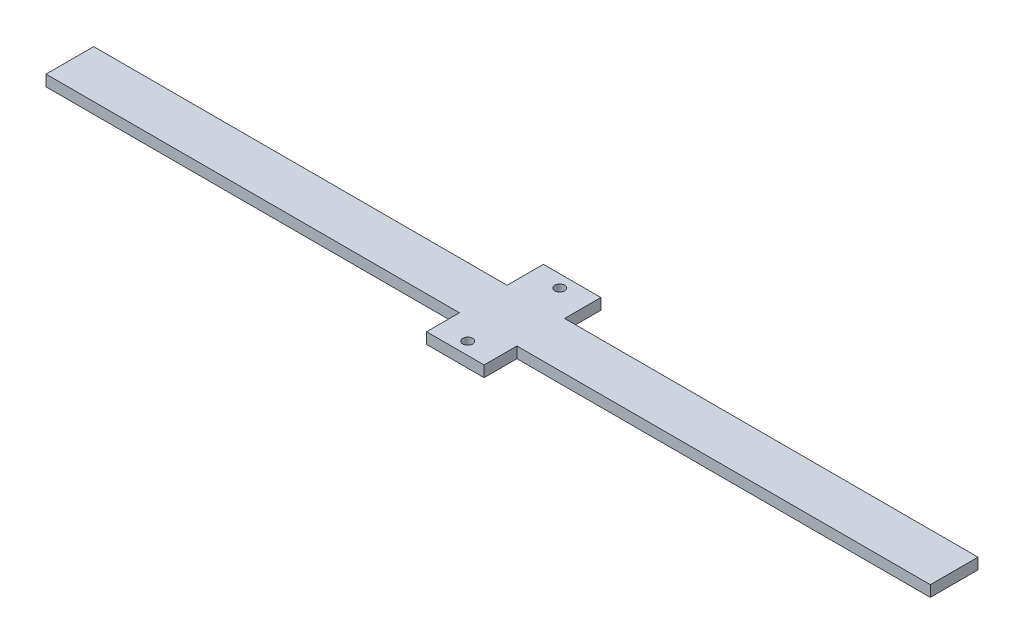
ISO-10303-21;
HEADER;
FILE_DESCRIPTION(('STEP AP214'),'2;1');
FILE_NAME('part.step','',(''),(''),'','','');
FILE_SCHEMA(('AUTOMOTIVE_DESIGN { 1 0 10303 214 1 1 1 1 }'));
ENDSEC;
DATA;
#1=APPLICATION_CONTEXT('core data for automotive mechanical design processes');
#2=APPLICATION_PROTOCOL_DEFINITION('international standard','automotive_design',2000,#1);
#3=PRODUCT_CONTEXT('',#1,'mechanical');
#4=PRODUCT('Part','Part','',(#3));
#5=PRODUCT_RELATED_PRODUCT_CATEGORY('part','',(#4));
#6=PRODUCT_DEFINITION_FORMATION('','',#4);
#7=PRODUCT_DEFINITION_CONTEXT('part definition',#1,'design');
#8=PRODUCT_DEFINITION('design','',#6,#7);
#9=PRODUCT_DEFINITION_SHAPE('','',#8);
#10=(LENGTH_UNIT() NAMED_UNIT(*) SI_UNIT(.MILLI.,.METRE.));
#11=(NAMED_UNIT(*) PLANE_ANGLE_UNIT() SI_UNIT($,.RADIAN.));
#12=(NAMED_UNIT(*) SI_UNIT($,.STERADIAN.) SOLID_ANGLE_UNIT());
#13=UNCERTAINTY_MEASURE_WITH_UNIT(LENGTH_MEASURE(1.E-05),#10,'distance_accuracy_value','');
#14=(GEOMETRIC_REPRESENTATION_CONTEXT(3) GLOBAL_UNCERTAINTY_ASSIGNED_CONTEXT((#13)) GLOBAL_UNIT_ASSIGNED_CONTEXT((#10,
#11,#12)) REPRESENTATION_CONTEXT('',''));
#15=CARTESIAN_POINT('',(0.,0.,0.));
#16=DIRECTION('',(0.,0.,1.));
#17=DIRECTION('',(1.,0.,0.));
#18=AXIS2_PLACEMENT_3D('',#15,#16,#17);
#19=CARTESIAN_POINT('',(0.,3.175,0.));
#20=DIRECTION('',(0.,-1.,0.));
#21=DIRECTION('',(0.,0.,-1.));
#22=AXIS2_PLACEMENT_3D('',#19,#20,#21);
#23=PLANE('',#22);
#24=DIRECTION('',(1.,0.,0.));
#25=VECTOR('',#24,1.);
#26=CARTESIAN_POINT('',(118.745,3.175,0.));
#27=LINE('',#26,#25);
#28=CARTESIAN_POINT('',(0.,3.175,0.));
#29=VERTEX_POINT('',#28);
#30=CARTESIAN_POINT('',(118.745,3.175,0.));
#31=VERTEX_POINT('',#30);
#32=EDGE_CURVE('E180',#29,#31,#27,.T.);
#33=ORIENTED_EDGE('',*,*,#32,.T.);
#34=DIRECTION('',(0.,0.,1.));
#35=VECTOR('',#34,1.);
#36=CARTESIAN_POINT('',(118.745,3.175,0.));
#37=LINE('',#36,#35);
#38=CARTESIAN_POINT('',(118.745,3.175,9.42770270697199));
#39=VERTEX_POINT('',#38);
#40=EDGE_CURVE('E108',#31,#39,#37,.T.);
#41=ORIENTED_EDGE('',*,*,#40,.T.);
#42=DIRECTION('',(1.,0.,0.));
#43=VECTOR('',#42,1.);
#44=CARTESIAN_POINT('',(118.745,3.175,9.42770270697199));
#45=LINE('',#44,#43);
#46=CARTESIAN_POINT('',(135.255,3.175,9.42770270697199));
#47=VERTEX_POINT('',#46);
#48=EDGE_CURVE('E207',#39,#47,#45,.T.);
#49=ORIENTED_EDGE('',*,*,#48,.T.);
#50=DIRECTION('',(0.,0.,-1.));
#51=VECTOR('',#50,1.);
#52=CARTESIAN_POINT('',(135.255,3.175,9.42770270697199));
#53=LINE('',#52,#51);
#54=CARTESIAN_POINT('',(135.255,3.175,0.));
#55=VERTEX_POINT('',#54);
#56=EDGE_CURVE('E226',#47,#55,#53,.T.);
#57=ORIENTED_EDGE('',*,*,#56,.T.);
#58=DIRECTION('',(1.,0.,0.));
#59=VECTOR('',#58,1.);
#60=CARTESIAN_POINT('',(254.,3.175,0.));
#61=LINE('',#60,#59);
#62=CARTESIAN_POINT('',(254.,3.175,0.));
#63=VERTEX_POINT('',#62);
#64=EDGE_CURVE('E223',#55,#63,#61,.T.);
#65=ORIENTED_EDGE('',*,*,#64,.T.);
#66=DIRECTION('',(0.,0.,-1.));
#67=VECTOR('',#66,1.);
#68=CARTESIAN_POINT('',(254.,3.175,-13.6906));
#69=LINE('',#68,#67);
#70=CARTESIAN_POINT('',(254.,3.175,-13.6906));
#71=VERTEX_POINT('',#70);
#72=EDGE_CURVE('E225',#63,#71,#69,.T.);
#73=ORIENTED_EDGE('',*,*,#72,.T.);
#74=DIRECTION('',(-1.,0.,0.));
#75=VECTOR('',#74,1.);
#76=CARTESIAN_POINT('',(135.255,3.175,-13.6906));
#77=LINE('',#76,#75);
#78=CARTESIAN_POINT('',(135.255,3.175,-13.6906));
#79=VERTEX_POINT('',#78);
#80=EDGE_CURVE('E228',#71,#79,#77,.T.);
#81=ORIENTED_EDGE('',*,*,#80,.T.);
#82=DIRECTION('',(0.,0.,-1.));
#83=VECTOR('',#82,1.);
#84=CARTESIAN_POINT('',(135.255,3.175,-24.118454648424));
#85=LINE('',#84,#83);
#86=CARTESIAN_POINT('',(135.255,3.175,-24.118454648424));
#87=VERTEX_POINT('',#86);
#88=EDGE_CURVE('E234',#79,#87,#85,.T.);
#89=ORIENTED_EDGE('',*,*,#88,.T.);
#90=DIRECTION('',(-1.,0.,0.));
#91=VECTOR('',#90,1.);
#92=CARTESIAN_POINT('',(118.745,3.175,-24.118454648424));
#93=LINE('',#92,#91);
#94=CARTESIAN_POINT('',(118.745,3.175,-24.118454648424));
#95=VERTEX_POINT('',#94);
#96=EDGE_CURVE('E139',#87,#95,#93,.T.);
#97=ORIENTED_EDGE('',*,*,#96,.T.);
#98=DIRECTION('',(0.,0.,1.));
#99=VECTOR('',#98,1.);
#100=CARTESIAN_POINT('',(118.745,3.175,-13.6906));
#101=LINE('',#100,#99);
#102=CARTESIAN_POINT('',(118.745,3.175,-13.6906));
#103=VERTEX_POINT('',#102);
#104=EDGE_CURVE('E133',#95,#103,#101,.T.);
#105=ORIENTED_EDGE('',*,*,#104,.T.);
#106=DIRECTION('',(-1.,0.,0.));
#107=VECTOR('',#106,1.);
#108=CARTESIAN_POINT('',(0.,3.175,-13.6906));
#109=LINE('',#108,#107);
#110=CARTESIAN_POINT('',(0.,3.175,-13.6906));
#111=VERTEX_POINT('',#110);
#112=EDGE_CURVE('E137',#103,#111,#109,.T.);
#113=ORIENTED_EDGE('',*,*,#112,.T.);
#114=DIRECTION('',(0.,0.,1.));
#115=VECTOR('',#114,1.);
#116=CARTESIAN_POINT('',(0.,3.175,0.));
#117=LINE('',#116,#115);
#118=EDGE_CURVE('E53',#111,#29,#117,.T.);
#119=ORIENTED_EDGE('',*,*,#118,.T.);
#120=EDGE_LOOP('',(#33,#41,#49,#57,#65,#73,#81,#89,#97,#105,#113,#119));
#121=FACE_BOUND('',#120,.T.);
#122=CARTESIAN_POINT('',(127.,3.175,-20.562454648424));
#123=DIRECTION('',(0.,1.,0.));
#124=DIRECTION('',(0.,0.,1.));
#125=AXIS2_PLACEMENT_3D('',#122,#123,#124);
#126=CIRCLE('',#125,1.42239999999999);
#127=CARTESIAN_POINT('',(127.,3.175,-19.1400546484241));
#128=VERTEX_POINT('',#127);
#129=EDGE_CURVE('E161',#128,#128,#126,.T.);
#130=ORIENTED_EDGE('',*,*,#129,.F.);
#131=EDGE_LOOP('',(#130));
#132=FACE_BOUND('',#131,.T.);
#133=CARTESIAN_POINT('',(127.,3.175,5.87170270697199));
#134=DIRECTION('',(0.,1.,0.));
#135=DIRECTION('',(0.,0.,1.));
#136=AXIS2_PLACEMENT_3D('',#133,#134,#135);
#137=CIRCLE('',#136,1.42239999999999);
#138=CARTESIAN_POINT('',(127.,3.175,7.29410270697198));
#139=VERTEX_POINT('',#138);
#140=EDGE_CURVE('E275',#139,#139,#137,.T.);
#141=ORIENTED_EDGE('',*,*,#140,.F.);
#142=EDGE_LOOP('',(#141));
#143=FACE_BOUND('',#142,.T.);
#144=ADVANCED_FACE('F36',(#121,#132,#143),#23,.F.);
#145=CARTESIAN_POINT('',(0.,0.,0.));
#146=DIRECTION('',(0.,-1.,0.));
#147=DIRECTION('',(0.,0.,-1.));
#148=AXIS2_PLACEMENT_3D('',#145,#146,#147);
#149=PLANE('',#148);
#150=CARTESIAN_POINT('',(127.,0.,-20.562454648424));
#151=DIRECTION('',(0.,1.,0.));
#152=DIRECTION('',(0.,0.,1.));
#153=AXIS2_PLACEMENT_3D('',#150,#151,#152);
#154=CIRCLE('',#153,1.42239999999999);
#155=CARTESIAN_POINT('',(127.,0.,-19.1400546484241));
#156=VERTEX_POINT('',#155);
#157=EDGE_CURVE('E280',#156,#156,#154,.T.);
#158=ORIENTED_EDGE('',*,*,#157,.T.);
#159=EDGE_LOOP('',(#158));
#160=FACE_BOUND('',#159,.T.);
#161=DIRECTION('',(1.,0.,0.));
#162=VECTOR('',#161,1.);
#163=CARTESIAN_POINT('',(118.745,0.,0.));
#164=LINE('',#163,#162);
#165=CARTESIAN_POINT('',(0.,0.,0.));
#166=VERTEX_POINT('',#165);
#167=CARTESIAN_POINT('',(118.745,0.,0.));
#168=VERTEX_POINT('',#167);
#169=EDGE_CURVE('E157',#166,#168,#164,.T.);
#170=ORIENTED_EDGE('',*,*,#169,.F.);
#171=DIRECTION('',(0.,0.,1.));
#172=VECTOR('',#171,1.);
#173=CARTESIAN_POINT('',(0.,0.,0.));
#174=LINE('',#173,#172);
#175=CARTESIAN_POINT('',(0.,0.,-13.6906));
#176=VERTEX_POINT('',#175);
#177=EDGE_CURVE('E100',#176,#166,#174,.T.);
#178=ORIENTED_EDGE('',*,*,#177,.F.);
#179=DIRECTION('',(-1.,0.,0.));
#180=VECTOR('',#179,1.);
#181=CARTESIAN_POINT('',(0.,0.,-13.6906));
#182=LINE('',#181,#180);
#183=CARTESIAN_POINT('',(118.745,0.,-13.6906));
#184=VERTEX_POINT('',#183);
#185=EDGE_CURVE('E94',#184,#176,#182,.T.);
#186=ORIENTED_EDGE('',*,*,#185,.F.);
#187=DIRECTION('',(0.,0.,1.));
#188=VECTOR('',#187,1.);
#189=CARTESIAN_POINT('',(118.745,0.,-13.6906));
#190=LINE('',#189,#188);
#191=CARTESIAN_POINT('',(118.745,0.,-24.118454648424));
#192=VERTEX_POINT('',#191);
#193=EDGE_CURVE('E147',#192,#184,#190,.T.);
#194=ORIENTED_EDGE('',*,*,#193,.F.);
#195=DIRECTION('',(-1.,0.,0.));
#196=VECTOR('',#195,1.);
#197=CARTESIAN_POINT('',(118.745,0.,-24.118454648424));
#198=LINE('',#197,#196);
#199=CARTESIAN_POINT('',(135.255,0.,-24.118454648424));
#200=VERTEX_POINT('',#199);
#201=EDGE_CURVE('E175',#200,#192,#198,.T.);
#202=ORIENTED_EDGE('',*,*,#201,.F.);
#203=DIRECTION('',(0.,0.,-1.));
#204=VECTOR('',#203,1.);
#205=CARTESIAN_POINT('',(135.255,0.,-24.118454648424));
#206=LINE('',#205,#204);
#207=CARTESIAN_POINT('',(135.255,0.,-13.6906));
#208=VERTEX_POINT('',#207);
#209=EDGE_CURVE('E173',#208,#200,#206,.T.);
#210=ORIENTED_EDGE('',*,*,#209,.F.);
#211=DIRECTION('',(-1.,0.,0.));
#212=VECTOR('',#211,1.);
#213=CARTESIAN_POINT('',(135.255,0.,-13.6906));
#214=LINE('',#213,#212);
#215=CARTESIAN_POINT('',(254.,0.,-13.6906));
#216=VERTEX_POINT('',#215);
#217=EDGE_CURVE('E171',#216,#208,#214,.T.);
#218=ORIENTED_EDGE('',*,*,#217,.F.);
#219=DIRECTION('',(0.,0.,-1.));
#220=VECTOR('',#219,1.);
#221=CARTESIAN_POINT('',(254.,0.,-13.6906));
#222=LINE('',#221,#220);
#223=CARTESIAN_POINT('',(254.,0.,0.));
#224=VERTEX_POINT('',#223);
#225=EDGE_CURVE('E169',#224,#216,#222,.T.);
#226=ORIENTED_EDGE('',*,*,#225,.F.);
#227=DIRECTION('',(1.,0.,0.));
#228=VECTOR('',#227,1.);
#229=CARTESIAN_POINT('',(254.,0.,0.));
#230=LINE('',#229,#228);
#231=CARTESIAN_POINT('',(135.255,0.,0.));
#232=VERTEX_POINT('',#231);
#233=EDGE_CURVE('E167',#232,#224,#230,.T.);
#234=ORIENTED_EDGE('',*,*,#233,.F.);
#235=DIRECTION('',(0.,0.,-1.));
#236=VECTOR('',#235,1.);
#237=CARTESIAN_POINT('',(135.255,0.,9.42770270697199));
#238=LINE('',#237,#236);
#239=CARTESIAN_POINT('',(135.255,0.,9.42770270697199));
#240=VERTEX_POINT('',#239);
#241=EDGE_CURVE('E165',#240,#232,#238,.T.);
#242=ORIENTED_EDGE('',*,*,#241,.F.);
#243=DIRECTION('',(1.,0.,0.));
#244=VECTOR('',#243,1.);
#245=CARTESIAN_POINT('',(118.745,0.,9.42770270697199));
#246=LINE('',#245,#244);
#247=CARTESIAN_POINT('',(118.745,0.,9.42770270697199));
#248=VERTEX_POINT('',#247);
#249=EDGE_CURVE('E163',#248,#240,#246,.T.);
#250=ORIENTED_EDGE('',*,*,#249,.F.);
#251=DIRECTION('',(0.,0.,1.));
#252=VECTOR('',#251,1.);
#253=CARTESIAN_POINT('',(118.745,0.,0.));
#254=LINE('',#253,#252);
#255=EDGE_CURVE('E160',#168,#248,#254,.T.);
#256=ORIENTED_EDGE('',*,*,#255,.F.);
#257=EDGE_LOOP('',(#170,#178,#186,#194,#202,#210,#218,#226,#234,#242,#250,#256));
#258=FACE_BOUND('',#257,.T.);
#259=CARTESIAN_POINT('',(127.,0.,5.87170270697199));
#260=DIRECTION('',(0.,1.,0.));
#261=DIRECTION('',(0.,0.,1.));
#262=AXIS2_PLACEMENT_3D('',#259,#260,#261);
#263=CIRCLE('',#262,1.42239999999999);
#264=CARTESIAN_POINT('',(127.,0.,7.29410270697198));
#265=VERTEX_POINT('',#264);
#266=EDGE_CURVE('E278',#265,#265,#263,.T.);
#267=ORIENTED_EDGE('',*,*,#266,.T.);
#268=EDGE_LOOP('',(#267));
#269=FACE_BOUND('',#268,.T.);
#270=ADVANCED_FACE('F211',(#160,#258,#269),#149,.T.);
#271=CARTESIAN_POINT('',(118.745,3.175,0.));
#272=DIRECTION('',(0.,0.,-1.));
#273=DIRECTION('',(-1.,0.,0.));
#274=AXIS2_PLACEMENT_3D('',#271,#272,#273);
#275=PLANE('',#274);
#276=ORIENTED_EDGE('',*,*,#169,.T.);
#277=DIRECTION('',(0.,-1.,0.));
#278=VECTOR('',#277,1.);
#279=CARTESIAN_POINT('',(118.745,3.175,0.));
#280=LINE('',#279,#278);
#281=EDGE_CURVE('E11',#31,#168,#280,.T.);
#282=ORIENTED_EDGE('',*,*,#281,.F.);
#283=ORIENTED_EDGE('',*,*,#32,.F.);
#284=DIRECTION('',(0.,-1.,0.));
#285=VECTOR('',#284,1.);
#286=CARTESIAN_POINT('',(0.,3.175,0.));
#287=LINE('',#286,#285);
#288=EDGE_CURVE('E153',#29,#166,#287,.T.);
#289=ORIENTED_EDGE('',*,*,#288,.T.);
#290=EDGE_LOOP('',(#276,#282,#283,#289));
#291=FACE_BOUND('',#290,.T.);
#292=ADVANCED_FACE('F38',(#291),#275,.F.);
#293=CARTESIAN_POINT('',(118.745,3.175,0.));
#294=DIRECTION('',(1.,0.,0.));
#295=DIRECTION('',(0.,0.,-1.));
#296=AXIS2_PLACEMENT_3D('',#293,#294,#295);
#297=PLANE('',#296);
#298=ORIENTED_EDGE('',*,*,#255,.T.);
#299=DIRECTION('',(0.,-1.,0.));
#300=VECTOR('',#299,1.);
#301=CARTESIAN_POINT('',(118.745,3.175,9.42770270697199));
#302=LINE('',#301,#300);
#303=EDGE_CURVE('E45',#39,#248,#302,.T.);
#304=ORIENTED_EDGE('',*,*,#303,.F.);
#305=ORIENTED_EDGE('',*,*,#40,.F.);
#306=ORIENTED_EDGE('',*,*,#281,.T.);
#307=EDGE_LOOP('',(#298,#304,#305,#306));
#308=FACE_BOUND('',#307,.T.);
#309=ADVANCED_FACE('F375',(#308),#297,.F.);
#310=CARTESIAN_POINT('',(118.745,3.175,9.42770270697199));
#311=DIRECTION('',(0.,0.,-1.));
#312=DIRECTION('',(-1.,0.,0.));
#313=AXIS2_PLACEMENT_3D('',#310,#311,#312);
#314=PLANE('',#313);
#315=ORIENTED_EDGE('',*,*,#249,.T.);
#316=DIRECTION('',(0.,-1.,0.));
#317=VECTOR('',#316,1.);
#318=CARTESIAN_POINT('',(135.255,3.175,9.42770270697199));
#319=LINE('',#318,#317);
#320=EDGE_CURVE('E199',#47,#240,#319,.T.);
#321=ORIENTED_EDGE('',*,*,#320,.F.);
#322=ORIENTED_EDGE('',*,*,#48,.F.);
#323=ORIENTED_EDGE('',*,*,#303,.T.);
#324=EDGE_LOOP('',(#315,#321,#322,#323));
#325=FACE_BOUND('',#324,.T.);
#326=ADVANCED_FACE('F205',(#325),#314,.F.);
#327=CARTESIAN_POINT('',(135.255,3.175,9.42770270697199));
#328=DIRECTION('',(-1.,0.,0.));
#329=DIRECTION('',(0.,0.,1.));
#330=AXIS2_PLACEMENT_3D('',#327,#328,#329);
#331=PLANE('',#330);
#332=ORIENTED_EDGE('',*,*,#241,.T.);
#333=DIRECTION('',(0.,-1.,0.));
#334=VECTOR('',#333,1.);
#335=CARTESIAN_POINT('',(135.255,3.175,0.));
#336=LINE('',#335,#334);
#337=EDGE_CURVE('E196',#55,#232,#336,.T.);
#338=ORIENTED_EDGE('',*,*,#337,.F.);
#339=ORIENTED_EDGE('',*,*,#56,.F.);
#340=ORIENTED_EDGE('',*,*,#320,.T.);
#341=EDGE_LOOP('',(#332,#338,#339,#340));
#342=FACE_BOUND('',#341,.T.);
#343=ADVANCED_FACE('F217',(#342),#331,.F.);
#344=CARTESIAN_POINT('',(254.,3.175,0.));
#345=DIRECTION('',(0.,0.,-1.));
#346=DIRECTION('',(-1.,0.,0.));
#347=AXIS2_PLACEMENT_3D('',#344,#345,#346);
#348=PLANE('',#347);
#349=ORIENTED_EDGE('',*,*,#233,.T.);
#350=DIRECTION('',(0.,-1.,0.));
#351=VECTOR('',#350,1.);
#352=CARTESIAN_POINT('',(254.,3.175,0.));
#353=LINE('',#352,#351);
#354=EDGE_CURVE('E193',#63,#224,#353,.T.);
#355=ORIENTED_EDGE('',*,*,#354,.F.);
#356=ORIENTED_EDGE('',*,*,#64,.F.);
#357=ORIENTED_EDGE('',*,*,#337,.T.);
#358=EDGE_LOOP('',(#349,#355,#356,#357));
#359=FACE_BOUND('',#358,.T.);
#360=ADVANCED_FACE('F221',(#359),#348,.F.);
#361=CARTESIAN_POINT('',(254.,3.175,-13.6906));
#362=DIRECTION('',(-1.,0.,0.));
#363=DIRECTION('',(0.,0.,1.));
#364=AXIS2_PLACEMENT_3D('',#361,#362,#363);
#365=PLANE('',#364);
#366=ORIENTED_EDGE('',*,*,#225,.T.);
#367=DIRECTION('',(0.,-1.,0.));
#368=VECTOR('',#367,1.);
#369=CARTESIAN_POINT('',(254.,3.175,-13.6906));
#370=LINE('',#369,#368);
#371=EDGE_CURVE('E190',#71,#216,#370,.T.);
#372=ORIENTED_EDGE('',*,*,#371,.F.);
#373=ORIENTED_EDGE('',*,*,#72,.F.);
#374=ORIENTED_EDGE('',*,*,#354,.T.);
#375=EDGE_LOOP('',(#366,#372,#373,#374));
#376=FACE_BOUND('',#375,.T.);
#377=ADVANCED_FACE('F340',(#376),#365,.F.);
#378=CARTESIAN_POINT('',(135.255,3.175,-13.6906));
#379=DIRECTION('',(0.,0.,1.));
#380=DIRECTION('',(1.,0.,0.));
#381=AXIS2_PLACEMENT_3D('',#378,#379,#380);
#382=PLANE('',#381);
#383=ORIENTED_EDGE('',*,*,#217,.T.);
#384=DIRECTION('',(0.,-1.,0.));
#385=VECTOR('',#384,1.);
#386=CARTESIAN_POINT('',(135.255,3.175,-13.6906));
#387=LINE('',#386,#385);
#388=EDGE_CURVE('E187',#79,#208,#387,.T.);
#389=ORIENTED_EDGE('',*,*,#388,.F.);
#390=ORIENTED_EDGE('',*,*,#80,.F.);
#391=ORIENTED_EDGE('',*,*,#371,.T.);
#392=EDGE_LOOP('',(#383,#389,#390,#391));
#393=FACE_BOUND('',#392,.T.);
#394=ADVANCED_FACE('F331',(#393),#382,.F.);
#395=CARTESIAN_POINT('',(135.255,3.175,-24.118454648424));
#396=DIRECTION('',(-1.,0.,0.));
#397=DIRECTION('',(0.,0.,1.));
#398=AXIS2_PLACEMENT_3D('',#395,#396,#397);
#399=PLANE('',#398);
#400=ORIENTED_EDGE('',*,*,#209,.T.);
#401=DIRECTION('',(0.,-1.,0.));
#402=VECTOR('',#401,1.);
#403=CARTESIAN_POINT('',(135.255,3.175,-24.118454648424));
#404=LINE('',#403,#402);
#405=EDGE_CURVE('E184',#87,#200,#404,.T.);
#406=ORIENTED_EDGE('',*,*,#405,.F.);
#407=ORIENTED_EDGE('',*,*,#88,.F.);
#408=ORIENTED_EDGE('',*,*,#388,.T.);
#409=EDGE_LOOP('',(#400,#406,#407,#408));
#410=FACE_BOUND('',#409,.T.);
#411=ADVANCED_FACE('F240',(#410),#399,.F.);
#412=CARTESIAN_POINT('',(118.745,3.175,-24.118454648424));
#413=DIRECTION('',(0.,0.,1.));
#414=DIRECTION('',(1.,0.,0.));
#415=AXIS2_PLACEMENT_3D('',#412,#413,#414);
#416=PLANE('',#415);
#417=ORIENTED_EDGE('',*,*,#201,.T.);
#418=DIRECTION('',(0.,-1.,0.));
#419=VECTOR('',#418,1.);
#420=CARTESIAN_POINT('',(118.745,3.175,-24.118454648424));
#421=LINE('',#420,#419);
#422=EDGE_CURVE('E148',#95,#192,#421,.T.);
#423=ORIENTED_EDGE('',*,*,#422,.F.);
#424=ORIENTED_EDGE('',*,*,#96,.F.);
#425=ORIENTED_EDGE('',*,*,#405,.T.);
#426=EDGE_LOOP('',(#417,#423,#424,#425));
#427=FACE_BOUND('',#426,.T.);
#428=ADVANCED_FACE('F244',(#427),#416,.F.);
#429=CARTESIAN_POINT('',(118.745,3.175,-13.6906));
#430=DIRECTION('',(1.,0.,0.));
#431=DIRECTION('',(0.,0.,-1.));
#432=AXIS2_PLACEMENT_3D('',#429,#430,#431);
#433=PLANE('',#432);
#434=ORIENTED_EDGE('',*,*,#193,.T.);
#435=DIRECTION('',(0.,-1.,0.));
#436=VECTOR('',#435,1.);
#437=CARTESIAN_POINT('',(118.745,3.175,-13.6906));
#438=LINE('',#437,#436);
#439=EDGE_CURVE('E144',#103,#184,#438,.T.);
#440=ORIENTED_EDGE('',*,*,#439,.F.);
#441=ORIENTED_EDGE('',*,*,#104,.F.);
#442=ORIENTED_EDGE('',*,*,#422,.T.);
#443=EDGE_LOOP('',(#434,#440,#441,#442));
#444=FACE_BOUND('',#443,.T.);
#445=ADVANCED_FACE('F145',(#444),#433,.F.);
#446=CARTESIAN_POINT('',(0.,3.175,-13.6906));
#447=DIRECTION('',(0.,0.,1.));
#448=DIRECTION('',(1.,0.,0.));
#449=AXIS2_PLACEMENT_3D('',#446,#447,#448);
#450=PLANE('',#449);
#451=ORIENTED_EDGE('',*,*,#185,.T.);
#452=DIRECTION('',(0.,-1.,0.));
#453=VECTOR('',#452,1.);
#454=CARTESIAN_POINT('',(0.,3.175,-13.6906));
#455=LINE('',#454,#453);
#456=EDGE_CURVE('E149',#111,#176,#455,.T.);
#457=ORIENTED_EDGE('',*,*,#456,.F.);
#458=ORIENTED_EDGE('',*,*,#112,.F.);
#459=ORIENTED_EDGE('',*,*,#439,.T.);
#460=EDGE_LOOP('',(#451,#457,#458,#459));
#461=FACE_BOUND('',#460,.T.);
#462=ADVANCED_FACE('F151',(#461),#450,.F.);
#463=CARTESIAN_POINT('',(0.,3.175,0.));
#464=DIRECTION('',(1.,0.,0.));
#465=DIRECTION('',(0.,0.,-1.));
#466=AXIS2_PLACEMENT_3D('',#463,#464,#465);
#467=PLANE('',#466);
#468=ORIENTED_EDGE('',*,*,#177,.T.);
#469=ORIENTED_EDGE('',*,*,#288,.F.);
#470=ORIENTED_EDGE('',*,*,#118,.F.);
#471=ORIENTED_EDGE('',*,*,#456,.T.);
#472=EDGE_LOOP('',(#468,#469,#470,#471));
#473=FACE_BOUND('',#472,.T.);
#474=ADVANCED_FACE('F248',(#473),#467,.F.);
#475=CARTESIAN_POINT('',(127.,3.175,-20.562454648424));
#476=DIRECTION('',(0.,-1.,0.));
#477=DIRECTION('',(0.,0.,-1.));
#478=AXIS2_PLACEMENT_3D('',#475,#476,#477);
#479=CYLINDRICAL_SURFACE('',#478,1.42239999999999);
#480=ORIENTED_EDGE('',*,*,#129,.T.);
#481=EDGE_LOOP('',(#480));
#482=FACE_BOUND('',#481,.T.);
#483=ORIENTED_EDGE('',*,*,#157,.F.);
#484=EDGE_LOOP('',(#483));
#485=FACE_BOUND('',#484,.T.);
#486=ADVANCED_FACE('F250',(#482,#485),#479,.F.);
#487=CARTESIAN_POINT('',(127.,3.175,5.87170270697199));
#488=DIRECTION('',(0.,-1.,0.));
#489=DIRECTION('',(0.,0.,-1.));
#490=AXIS2_PLACEMENT_3D('',#487,#488,#489);
#491=CYLINDRICAL_SURFACE('',#490,1.42239999999999);
#492=ORIENTED_EDGE('',*,*,#140,.T.);
#493=EDGE_LOOP('',(#492));
#494=FACE_BOUND('',#493,.T.);
#495=ORIENTED_EDGE('',*,*,#266,.F.);
#496=EDGE_LOOP('',(#495));
#497=FACE_BOUND('',#496,.T.);
#498=ADVANCED_FACE('F256',(#494,#497),#491,.F.);
#499=CLOSED_SHELL('',(#144,#270,#292,#309,#326,#343,#360,#377,#394,#411,#428,#445,#462,#474,
#486,#498));
#500=MANIFOLD_SOLID_BREP('B2',#499);
#501=ADVANCED_BREP_SHAPE_REPRESENTATION('',(#18,#500),#14);
#502=SHAPE_DEFINITION_REPRESENTATION(#9,#501);
ENDSEC;
END-ISO-10303-21;
